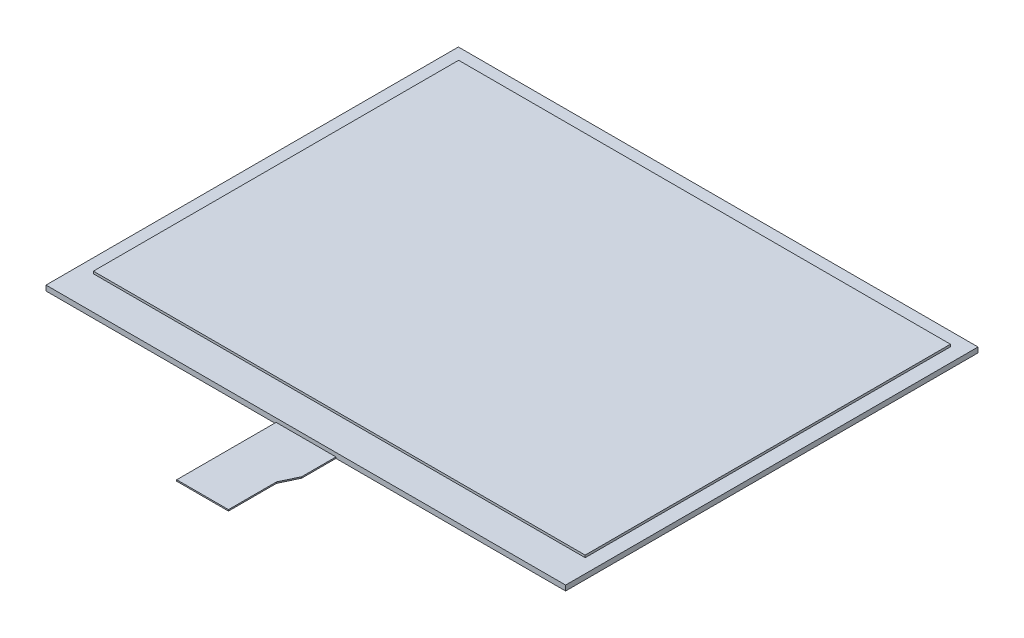
ISO-10303-21;
HEADER;
FILE_DESCRIPTION(('STEP AP214'),'2;1');
FILE_NAME('part.step','',(''),(''),'','','');
FILE_SCHEMA(('AUTOMOTIVE_DESIGN { 1 0 10303 214 1 1 1 1 }'));
ENDSEC;
DATA;
#1=APPLICATION_CONTEXT('core data for automotive mechanical design processes');
#2=APPLICATION_PROTOCOL_DEFINITION('international standard','automotive_design',2000,#1);
#3=PRODUCT_CONTEXT('',#1,'mechanical');
#4=PRODUCT('Part','Part','',(#3));
#5=PRODUCT_RELATED_PRODUCT_CATEGORY('part','',(#4));
#6=PRODUCT_DEFINITION_FORMATION('','',#4);
#7=PRODUCT_DEFINITION_CONTEXT('part definition',#1,'design');
#8=PRODUCT_DEFINITION('design','',#6,#7);
#9=PRODUCT_DEFINITION_SHAPE('','',#8);
#10=(LENGTH_UNIT() NAMED_UNIT(*) SI_UNIT(.MILLI.,.METRE.));
#11=(NAMED_UNIT(*) PLANE_ANGLE_UNIT() SI_UNIT($,.RADIAN.));
#12=(NAMED_UNIT(*) SI_UNIT($,.STERADIAN.) SOLID_ANGLE_UNIT());
#13=UNCERTAINTY_MEASURE_WITH_UNIT(LENGTH_MEASURE(1.E-05),#10,'distance_accuracy_value','');
#14=(GEOMETRIC_REPRESENTATION_CONTEXT(3) GLOBAL_UNCERTAINTY_ASSIGNED_CONTEXT((#13)) GLOBAL_UNIT_ASSIGNED_CONTEXT((#10,
#11,#12)) REPRESENTATION_CONTEXT('',''));
#15=CARTESIAN_POINT('',(0.,0.,0.));
#16=DIRECTION('',(0.,0.,1.));
#17=DIRECTION('',(1.,0.,0.));
#18=AXIS2_PLACEMENT_3D('',#15,#16,#17);
#19=CARTESIAN_POINT('',(0.,1.25,99.6));
#20=DIRECTION('',(0.,0.,-1.));
#21=DIRECTION('',(-1.,0.,0.));
#22=AXIS2_PLACEMENT_3D('',#19,#20,#21);
#23=PLANE('',#22);
#24=DIRECTION('',(0.,-1.,0.));
#25=VECTOR('',#24,1.);
#26=CARTESIAN_POINT('',(55.57,0.315,99.6));
#27=LINE('',#26,#25);
#28=CARTESIAN_POINT('',(55.57,0.315,99.6));
#29=VERTEX_POINT('',#28);
#30=CARTESIAN_POINT('',(55.57,0.,99.6));
#31=VERTEX_POINT('',#30);
#32=EDGE_CURVE('E158',#29,#31,#27,.T.);
#33=ORIENTED_EDGE('',*,*,#32,.F.);
#34=DIRECTION('',(1.,0.,0.));
#35=VECTOR('',#34,1.);
#36=CARTESIAN_POINT('',(55.57,0.315,99.6));
#37=LINE('',#36,#35);
#38=CARTESIAN_POINT('',(70.03,0.315,99.6));
#39=VERTEX_POINT('',#38);
#40=EDGE_CURVE('E143',#29,#39,#37,.T.);
#41=ORIENTED_EDGE('',*,*,#40,.T.);
#42=DIRECTION('',(0.,-1.,0.));
#43=VECTOR('',#42,1.);
#44=CARTESIAN_POINT('',(70.03,0.315,99.6));
#45=LINE('',#44,#43);
#46=CARTESIAN_POINT('',(70.03,0.,99.6));
#47=VERTEX_POINT('',#46);
#48=EDGE_CURVE('E165',#39,#47,#45,.T.);
#49=ORIENTED_EDGE('',*,*,#48,.T.);
#50=DIRECTION('',(1.,0.,0.));
#51=VECTOR('',#50,1.);
#52=CARTESIAN_POINT('',(0.,0.,99.6));
#53=LINE('',#52,#51);
#54=CARTESIAN_POINT('',(125.5,0.,99.6));
#55=VERTEX_POINT('',#54);
#56=EDGE_CURVE('E218',#47,#55,#53,.T.);
#57=ORIENTED_EDGE('',*,*,#56,.T.);
#58=DIRECTION('',(0.,-1.,0.));
#59=VECTOR('',#58,1.);
#60=CARTESIAN_POINT('',(125.5,1.25,99.6));
#61=LINE('',#60,#59);
#62=CARTESIAN_POINT('',(125.5,1.25,99.6));
#63=VERTEX_POINT('',#62);
#64=EDGE_CURVE('E49',#63,#55,#61,.T.);
#65=ORIENTED_EDGE('',*,*,#64,.F.);
#66=DIRECTION('',(1.,0.,0.));
#67=VECTOR('',#66,1.);
#68=CARTESIAN_POINT('',(0.,1.25,99.6));
#69=LINE('',#68,#67);
#70=CARTESIAN_POINT('',(0.,1.25,99.6));
#71=VERTEX_POINT('',#70);
#72=EDGE_CURVE('E208',#71,#63,#69,.T.);
#73=ORIENTED_EDGE('',*,*,#72,.F.);
#74=DIRECTION('',(0.,-1.,0.));
#75=VECTOR('',#74,1.);
#76=CARTESIAN_POINT('',(0.,1.25,99.6));
#77=LINE('',#76,#75);
#78=CARTESIAN_POINT('',(0.,0.,99.6));
#79=VERTEX_POINT('',#78);
#80=EDGE_CURVE('E11',#71,#79,#77,.T.);
#81=ORIENTED_EDGE('',*,*,#80,.T.);
#82=EDGE_CURVE('E164',#79,#31,#53,.T.);
#83=ORIENTED_EDGE('',*,*,#82,.T.);
#84=EDGE_LOOP('',(#33,#41,#49,#57,#65,#73,#81,#83));
#85=FACE_BOUND('',#84,.T.);
#86=ADVANCED_FACE('F41',(#85),#23,.F.);
#87=CARTESIAN_POINT('',(0.,1.25,0.));
#88=DIRECTION('',(1.,0.,0.));
#89=DIRECTION('',(0.,0.,-1.));
#90=AXIS2_PLACEMENT_3D('',#87,#88,#89);
#91=PLANE('',#90);
#92=DIRECTION('',(0.,0.,1.));
#93=VECTOR('',#92,1.);
#94=CARTESIAN_POINT('',(0.,0.,0.));
#95=LINE('',#94,#93);
#96=CARTESIAN_POINT('',(0.,0.,0.));
#97=VERTEX_POINT('',#96);
#98=EDGE_CURVE('E204',#97,#79,#95,.T.);
#99=ORIENTED_EDGE('',*,*,#98,.T.);
#100=ORIENTED_EDGE('',*,*,#80,.F.);
#101=DIRECTION('',(0.,0.,1.));
#102=VECTOR('',#101,1.);
#103=CARTESIAN_POINT('',(0.,1.25,0.));
#104=LINE('',#103,#102);
#105=CARTESIAN_POINT('',(0.,1.25,0.));
#106=VERTEX_POINT('',#105);
#107=EDGE_CURVE('E205',#106,#71,#104,.T.);
#108=ORIENTED_EDGE('',*,*,#107,.F.);
#109=DIRECTION('',(0.,-1.,0.));
#110=VECTOR('',#109,1.);
#111=CARTESIAN_POINT('',(0.,1.25,0.));
#112=LINE('',#111,#110);
#113=EDGE_CURVE('E215',#106,#97,#112,.T.);
#114=ORIENTED_EDGE('',*,*,#113,.T.);
#115=EDGE_LOOP('',(#99,#100,#108,#114));
#116=FACE_BOUND('',#115,.T.);
#117=ADVANCED_FACE('F43',(#116),#91,.F.);
#118=CARTESIAN_POINT('',(125.5,1.25,0.));
#119=DIRECTION('',(-1.,0.,0.));
#120=DIRECTION('',(0.,0.,1.));
#121=AXIS2_PLACEMENT_3D('',#118,#119,#120);
#122=PLANE('',#121);
#123=DIRECTION('',(0.,0.,-1.));
#124=VECTOR('',#123,1.);
#125=CARTESIAN_POINT('',(125.5,0.,0.));
#126=LINE('',#125,#124);
#127=CARTESIAN_POINT('',(125.5,0.,0.));
#128=VERTEX_POINT('',#127);
#129=EDGE_CURVE('E220',#55,#128,#126,.T.);
#130=ORIENTED_EDGE('',*,*,#129,.T.);
#131=DIRECTION('',(0.,-1.,0.));
#132=VECTOR('',#131,1.);
#133=CARTESIAN_POINT('',(125.5,1.25,0.));
#134=LINE('',#133,#132);
#135=CARTESIAN_POINT('',(125.5,1.25,0.));
#136=VERTEX_POINT('',#135);
#137=EDGE_CURVE('E225',#136,#128,#134,.T.);
#138=ORIENTED_EDGE('',*,*,#137,.F.);
#139=DIRECTION('',(0.,0.,-1.));
#140=VECTOR('',#139,1.);
#141=CARTESIAN_POINT('',(125.5,1.25,0.));
#142=LINE('',#141,#140);
#143=EDGE_CURVE('E211',#63,#136,#142,.T.);
#144=ORIENTED_EDGE('',*,*,#143,.F.);
#145=ORIENTED_EDGE('',*,*,#64,.T.);
#146=EDGE_LOOP('',(#130,#138,#144,#145));
#147=FACE_BOUND('',#146,.T.);
#148=ADVANCED_FACE('F232',(#147),#122,.F.);
#149=CARTESIAN_POINT('',(0.,1.25,0.));
#150=DIRECTION('',(0.,0.,1.));
#151=DIRECTION('',(1.,0.,0.));
#152=AXIS2_PLACEMENT_3D('',#149,#150,#151);
#153=PLANE('',#152);
#154=DIRECTION('',(-1.,0.,0.));
#155=VECTOR('',#154,1.);
#156=CARTESIAN_POINT('',(0.,0.,0.));
#157=LINE('',#156,#155);
#158=EDGE_CURVE('E209',#128,#97,#157,.T.);
#159=ORIENTED_EDGE('',*,*,#158,.T.);
#160=ORIENTED_EDGE('',*,*,#113,.F.);
#161=DIRECTION('',(-1.,0.,0.));
#162=VECTOR('',#161,1.);
#163=CARTESIAN_POINT('',(0.,1.25,0.));
#164=LINE('',#163,#162);
#165=EDGE_CURVE('E213',#136,#106,#164,.T.);
#166=ORIENTED_EDGE('',*,*,#165,.F.);
#167=ORIENTED_EDGE('',*,*,#137,.T.);
#168=EDGE_LOOP('',(#159,#160,#166,#167));
#169=FACE_BOUND('',#168,.T.);
#170=ADVANCED_FACE('F241',(#169),#153,.F.);
#171=CARTESIAN_POINT('',(0.,1.25,0.));
#172=DIRECTION('',(0.,1.,0.));
#173=DIRECTION('',(0.,0.,1.));
#174=AXIS2_PLACEMENT_3D('',#171,#172,#173);
#175=PLANE('',#174);
#176=DIRECTION('',(0.,0.,1.));
#177=VECTOR('',#176,1.);
#178=CARTESIAN_POINT('',(3.36,1.25,3.3));
#179=LINE('',#178,#177);
#180=CARTESIAN_POINT('',(3.36,1.25,3.3));
#181=VERTEX_POINT('',#180);
#182=CARTESIAN_POINT('',(3.36000000000001,1.25,91.52));
#183=VERTEX_POINT('',#182);
#184=EDGE_CURVE('E64',#181,#183,#179,.T.);
#185=ORIENTED_EDGE('',*,*,#184,.F.);
#186=DIRECTION('',(-1.,0.,0.));
#187=VECTOR('',#186,1.);
#188=CARTESIAN_POINT('',(3.36,1.25,3.3));
#189=LINE('',#188,#187);
#190=CARTESIAN_POINT('',(122.14,1.25,3.3));
#191=VERTEX_POINT('',#190);
#192=EDGE_CURVE('E178',#191,#181,#189,.T.);
#193=ORIENTED_EDGE('',*,*,#192,.F.);
#194=DIRECTION('',(0.,0.,-1.));
#195=VECTOR('',#194,1.);
#196=CARTESIAN_POINT('',(122.14,1.25,3.3));
#197=LINE('',#196,#195);
#198=CARTESIAN_POINT('',(122.14,1.25,91.52));
#199=VERTEX_POINT('',#198);
#200=EDGE_CURVE('E189',#199,#191,#197,.T.);
#201=ORIENTED_EDGE('',*,*,#200,.F.);
#202=DIRECTION('',(1.,0.,0.));
#203=VECTOR('',#202,1.);
#204=CARTESIAN_POINT('',(3.36000000000001,1.25,91.52));
#205=LINE('',#204,#203);
#206=EDGE_CURVE('E186',#183,#199,#205,.T.);
#207=ORIENTED_EDGE('',*,*,#206,.F.);
#208=EDGE_LOOP('',(#185,#193,#201,#207));
#209=FACE_BOUND('',#208,.T.);
#210=ORIENTED_EDGE('',*,*,#107,.T.);
#211=ORIENTED_EDGE('',*,*,#72,.T.);
#212=ORIENTED_EDGE('',*,*,#143,.T.);
#213=ORIENTED_EDGE('',*,*,#165,.T.);
#214=EDGE_LOOP('',(#210,#211,#212,#213));
#215=FACE_BOUND('',#214,.T.);
#216=ADVANCED_FACE('F247',(#209,#215),#175,.T.);
#217=CARTESIAN_POINT('',(0.,0.,0.));
#218=DIRECTION('',(0.,1.,0.));
#219=DIRECTION('',(0.,0.,1.));
#220=AXIS2_PLACEMENT_3D('',#217,#218,#219);
#221=PLANE('',#220);
#222=ORIENTED_EDGE('',*,*,#98,.F.);
#223=ORIENTED_EDGE('',*,*,#158,.F.);
#224=ORIENTED_EDGE('',*,*,#129,.F.);
#225=ORIENTED_EDGE('',*,*,#56,.F.);
#226=DIRECTION('',(0.,0.,1.));
#227=VECTOR('',#226,1.);
#228=CARTESIAN_POINT('',(70.03,0.,99.6));
#229=LINE('',#228,#227);
#230=CARTESIAN_POINT('',(70.03,0.,107.870480890408));
#231=VERTEX_POINT('',#230);
#232=EDGE_CURVE('E56',#47,#231,#229,.T.);
#233=ORIENTED_EDGE('',*,*,#232,.T.);
#234=DIRECTION('',(-0.42782749163252,0.,0.903860408140232));
#235=VECTOR('',#234,1.);
#236=CARTESIAN_POINT('',(68.07,0.,112.01132371749));
#237=LINE('',#236,#235);
#238=CARTESIAN_POINT('',(68.07,0.,112.01132371749));
#239=VERTEX_POINT('',#238);
#240=EDGE_CURVE('E399',#231,#239,#237,.T.);
#241=ORIENTED_EDGE('',*,*,#240,.T.);
#242=DIRECTION('',(0.,0.,1.));
#243=VECTOR('',#242,1.);
#244=CARTESIAN_POINT('',(68.07,0.,123.6));
#245=LINE('',#244,#243);
#246=CARTESIAN_POINT('',(68.07,0.,123.6));
#247=VERTEX_POINT('',#246);
#248=EDGE_CURVE('E404',#239,#247,#245,.T.);
#249=ORIENTED_EDGE('',*,*,#248,.T.);
#250=DIRECTION('',(-1.,0.,0.));
#251=VECTOR('',#250,1.);
#252=CARTESIAN_POINT('',(55.57,0.,123.6));
#253=LINE('',#252,#251);
#254=CARTESIAN_POINT('',(55.57,0.,123.6));
#255=VERTEX_POINT('',#254);
#256=EDGE_CURVE('E161',#247,#255,#253,.T.);
#257=ORIENTED_EDGE('',*,*,#256,.T.);
#258=DIRECTION('',(0.,0.,-1.));
#259=VECTOR('',#258,1.);
#260=CARTESIAN_POINT('',(55.57,0.,99.6));
#261=LINE('',#260,#259);
#262=EDGE_CURVE('E406',#255,#31,#261,.T.);
#263=ORIENTED_EDGE('',*,*,#262,.T.);
#264=ORIENTED_EDGE('',*,*,#82,.F.);
#265=EDGE_LOOP('',(#222,#223,#224,#225,#233,#241,#249,#257,#263,#264));
#266=FACE_BOUND('',#265,.T.);
#267=ADVANCED_FACE('F238',(#266),#221,.F.);
#268=CARTESIAN_POINT('',(3.36,1.8,3.3));
#269=DIRECTION('',(1.,0.,0.));
#270=DIRECTION('',(0.,0.,-1.));
#271=AXIS2_PLACEMENT_3D('',#268,#269,#270);
#272=PLANE('',#271);
#273=ORIENTED_EDGE('',*,*,#184,.T.);
#274=DIRECTION('',(0.,-1.,0.));
#275=VECTOR('',#274,1.);
#276=CARTESIAN_POINT('',(3.36000000000001,1.8,91.52));
#277=LINE('',#276,#275);
#278=CARTESIAN_POINT('',(3.36000000000001,1.8,91.52));
#279=VERTEX_POINT('',#278);
#280=EDGE_CURVE('E201',#279,#183,#277,.T.);
#281=ORIENTED_EDGE('',*,*,#280,.F.);
#282=DIRECTION('',(0.,0.,1.));
#283=VECTOR('',#282,1.);
#284=CARTESIAN_POINT('',(3.36,1.8,3.3));
#285=LINE('',#284,#283);
#286=CARTESIAN_POINT('',(3.36,1.8,3.3));
#287=VERTEX_POINT('',#286);
#288=EDGE_CURVE('E174',#287,#279,#285,.T.);
#289=ORIENTED_EDGE('',*,*,#288,.F.);
#290=DIRECTION('',(0.,-1.,0.));
#291=VECTOR('',#290,1.);
#292=CARTESIAN_POINT('',(3.36,1.8,3.3));
#293=LINE('',#292,#291);
#294=EDGE_CURVE('E184',#287,#181,#293,.T.);
#295=ORIENTED_EDGE('',*,*,#294,.T.);
#296=EDGE_LOOP('',(#273,#281,#289,#295));
#297=FACE_BOUND('',#296,.T.);
#298=ADVANCED_FACE('F255',(#297),#272,.F.);
#299=CARTESIAN_POINT('',(3.36000000000001,1.8,91.52));
#300=DIRECTION('',(0.,0.,-1.));
#301=DIRECTION('',(-1.,0.,0.));
#302=AXIS2_PLACEMENT_3D('',#299,#300,#301);
#303=PLANE('',#302);
#304=ORIENTED_EDGE('',*,*,#206,.T.);
#305=DIRECTION('',(0.,-1.,0.));
#306=VECTOR('',#305,1.);
#307=CARTESIAN_POINT('',(122.14,1.8,91.52));
#308=LINE('',#307,#306);
#309=CARTESIAN_POINT('',(122.14,1.8,91.52));
#310=VERTEX_POINT('',#309);
#311=EDGE_CURVE('E198',#310,#199,#308,.T.);
#312=ORIENTED_EDGE('',*,*,#311,.F.);
#313=DIRECTION('',(1.,0.,0.));
#314=VECTOR('',#313,1.);
#315=CARTESIAN_POINT('',(3.36000000000001,1.8,91.52));
#316=LINE('',#315,#314);
#317=EDGE_CURVE('E177',#279,#310,#316,.T.);
#318=ORIENTED_EDGE('',*,*,#317,.F.);
#319=ORIENTED_EDGE('',*,*,#280,.T.);
#320=EDGE_LOOP('',(#304,#312,#318,#319));
#321=FACE_BOUND('',#320,.T.);
#322=ADVANCED_FACE('F298',(#321),#303,.F.);
#323=CARTESIAN_POINT('',(122.14,1.8,3.3));
#324=DIRECTION('',(-1.,0.,0.));
#325=DIRECTION('',(0.,0.,1.));
#326=AXIS2_PLACEMENT_3D('',#323,#324,#325);
#327=PLANE('',#326);
#328=ORIENTED_EDGE('',*,*,#200,.T.);
#329=DIRECTION('',(0.,-1.,0.));
#330=VECTOR('',#329,1.);
#331=CARTESIAN_POINT('',(122.14,1.8,3.3));
#332=LINE('',#331,#330);
#333=CARTESIAN_POINT('',(122.14,1.8,3.3));
#334=VERTEX_POINT('',#333);
#335=EDGE_CURVE('E195',#334,#191,#332,.T.);
#336=ORIENTED_EDGE('',*,*,#335,.F.);
#337=DIRECTION('',(0.,0.,-1.));
#338=VECTOR('',#337,1.);
#339=CARTESIAN_POINT('',(122.14,1.8,3.3));
#340=LINE('',#339,#338);
#341=EDGE_CURVE('E180',#310,#334,#340,.T.);
#342=ORIENTED_EDGE('',*,*,#341,.F.);
#343=ORIENTED_EDGE('',*,*,#311,.T.);
#344=EDGE_LOOP('',(#328,#336,#342,#343));
#345=FACE_BOUND('',#344,.T.);
#346=ADVANCED_FACE('F307',(#345),#327,.F.);
#347=CARTESIAN_POINT('',(3.36,1.8,3.3));
#348=DIRECTION('',(0.,0.,1.));
#349=DIRECTION('',(1.,0.,0.));
#350=AXIS2_PLACEMENT_3D('',#347,#348,#349);
#351=PLANE('',#350);
#352=ORIENTED_EDGE('',*,*,#192,.T.);
#353=ORIENTED_EDGE('',*,*,#294,.F.);
#354=DIRECTION('',(-1.,0.,0.));
#355=VECTOR('',#354,1.);
#356=CARTESIAN_POINT('',(3.36,1.8,3.3));
#357=LINE('',#356,#355);
#358=EDGE_CURVE('E182',#334,#287,#357,.T.);
#359=ORIENTED_EDGE('',*,*,#358,.F.);
#360=ORIENTED_EDGE('',*,*,#335,.T.);
#361=EDGE_LOOP('',(#352,#353,#359,#360));
#362=FACE_BOUND('',#361,.T.);
#363=ADVANCED_FACE('F317',(#362),#351,.F.);
#364=CARTESIAN_POINT('',(0.,1.8,0.));
#365=DIRECTION('',(0.,1.,0.));
#366=DIRECTION('',(0.,0.,1.));
#367=AXIS2_PLACEMENT_3D('',#364,#365,#366);
#368=PLANE('',#367);
#369=ORIENTED_EDGE('',*,*,#288,.T.);
#370=ORIENTED_EDGE('',*,*,#317,.T.);
#371=ORIENTED_EDGE('',*,*,#341,.T.);
#372=ORIENTED_EDGE('',*,*,#358,.T.);
#373=EDGE_LOOP('',(#369,#370,#371,#372));
#374=FACE_BOUND('',#373,.T.);
#375=ADVANCED_FACE('F327',(#374),#368,.T.);
#376=CARTESIAN_POINT('',(55.57,0.315,99.6));
#377=DIRECTION('',(-1.,0.,0.));
#378=DIRECTION('',(0.,0.,1.));
#379=AXIS2_PLACEMENT_3D('',#376,#377,#378);
#380=PLANE('',#379);
#381=ORIENTED_EDGE('',*,*,#262,.F.);
#382=DIRECTION('',(0.,-1.,0.));
#383=VECTOR('',#382,1.);
#384=CARTESIAN_POINT('',(55.57,0.315,123.6));
#385=LINE('',#384,#383);
#386=CARTESIAN_POINT('',(55.57,0.315,123.6));
#387=VERTEX_POINT('',#386);
#388=EDGE_CURVE('E160',#387,#255,#385,.T.);
#389=ORIENTED_EDGE('',*,*,#388,.F.);
#390=DIRECTION('',(0.,0.,-1.));
#391=VECTOR('',#390,1.);
#392=CARTESIAN_POINT('',(55.57,0.315,99.6));
#393=LINE('',#392,#391);
#394=EDGE_CURVE('E147',#387,#29,#393,.T.);
#395=ORIENTED_EDGE('',*,*,#394,.T.);
#396=ORIENTED_EDGE('',*,*,#32,.T.);
#397=EDGE_LOOP('',(#381,#389,#395,#396));
#398=FACE_BOUND('',#397,.T.);
#399=ADVANCED_FACE('F157',(#398),#380,.T.);
#400=CARTESIAN_POINT('',(55.57,0.315,123.6));
#401=DIRECTION('',(0.,0.,1.));
#402=DIRECTION('',(1.,0.,0.));
#403=AXIS2_PLACEMENT_3D('',#400,#401,#402);
#404=PLANE('',#403);
#405=ORIENTED_EDGE('',*,*,#256,.F.);
#406=DIRECTION('',(0.,-1.,0.));
#407=VECTOR('',#406,1.);
#408=CARTESIAN_POINT('',(68.07,0.315,123.6));
#409=LINE('',#408,#407);
#410=CARTESIAN_POINT('',(68.07,0.315,123.6));
#411=VERTEX_POINT('',#410);
#412=EDGE_CURVE('E414',#411,#247,#409,.T.);
#413=ORIENTED_EDGE('',*,*,#412,.F.);
#414=DIRECTION('',(-1.,0.,0.));
#415=VECTOR('',#414,1.);
#416=CARTESIAN_POINT('',(55.57,0.315,123.6));
#417=LINE('',#416,#415);
#418=EDGE_CURVE('E166',#411,#387,#417,.T.);
#419=ORIENTED_EDGE('',*,*,#418,.T.);
#420=ORIENTED_EDGE('',*,*,#388,.T.);
#421=EDGE_LOOP('',(#405,#413,#419,#420));
#422=FACE_BOUND('',#421,.T.);
#423=ADVANCED_FACE('F346',(#422),#404,.T.);
#424=CARTESIAN_POINT('',(68.07,0.315,123.6));
#425=DIRECTION('',(1.,0.,0.));
#426=DIRECTION('',(0.,0.,-1.));
#427=AXIS2_PLACEMENT_3D('',#424,#425,#426);
#428=PLANE('',#427);
#429=ORIENTED_EDGE('',*,*,#248,.F.);
#430=DIRECTION('',(0.,-1.,0.));
#431=VECTOR('',#430,1.);
#432=CARTESIAN_POINT('',(68.07,0.315,112.01132371749));
#433=LINE('',#432,#431);
#434=CARTESIAN_POINT('',(68.07,0.315,112.01132371749));
#435=VERTEX_POINT('',#434);
#436=EDGE_CURVE('E401',#435,#239,#433,.T.);
#437=ORIENTED_EDGE('',*,*,#436,.F.);
#438=DIRECTION('',(0.,0.,1.));
#439=VECTOR('',#438,1.);
#440=CARTESIAN_POINT('',(68.07,0.315,123.6));
#441=LINE('',#440,#439);
#442=EDGE_CURVE('E170',#435,#411,#441,.T.);
#443=ORIENTED_EDGE('',*,*,#442,.T.);
#444=ORIENTED_EDGE('',*,*,#412,.T.);
#445=EDGE_LOOP('',(#429,#437,#443,#444));
#446=FACE_BOUND('',#445,.T.);
#447=ADVANCED_FACE('F354',(#446),#428,.T.);
#448=CARTESIAN_POINT('',(68.07,0.315,112.01132371749));
#449=DIRECTION('',(0.903860408140232,0.,0.42782749163252));
#450=DIRECTION('',(0.42782749163252,0.,-0.903860408140232));
#451=AXIS2_PLACEMENT_3D('',#448,#449,#450);
#452=PLANE('',#451);
#453=ORIENTED_EDGE('',*,*,#240,.F.);
#454=DIRECTION('',(0.,-1.,0.));
#455=VECTOR('',#454,1.);
#456=CARTESIAN_POINT('',(70.03,0.315,107.870480890408));
#457=LINE('',#456,#455);
#458=CARTESIAN_POINT('',(70.03,0.315,107.870480890408));
#459=VERTEX_POINT('',#458);
#460=EDGE_CURVE('E168',#459,#231,#457,.T.);
#461=ORIENTED_EDGE('',*,*,#460,.F.);
#462=DIRECTION('',(-0.42782749163252,0.,0.903860408140232));
#463=VECTOR('',#462,1.);
#464=CARTESIAN_POINT('',(68.07,0.315,112.01132371749));
#465=LINE('',#464,#463);
#466=EDGE_CURVE('E416',#459,#435,#465,.T.);
#467=ORIENTED_EDGE('',*,*,#466,.T.);
#468=ORIENTED_EDGE('',*,*,#436,.T.);
#469=EDGE_LOOP('',(#453,#461,#467,#468));
#470=FACE_BOUND('',#469,.T.);
#471=ADVANCED_FACE('F363',(#470),#452,.T.);
#472=CARTESIAN_POINT('',(70.03,0.315,99.6));
#473=DIRECTION('',(1.,0.,0.));
#474=DIRECTION('',(0.,0.,-1.));
#475=AXIS2_PLACEMENT_3D('',#472,#473,#474);
#476=PLANE('',#475);
#477=ORIENTED_EDGE('',*,*,#232,.F.);
#478=ORIENTED_EDGE('',*,*,#48,.F.);
#479=DIRECTION('',(0.,0.,1.));
#480=VECTOR('',#479,1.);
#481=CARTESIAN_POINT('',(70.03,0.315,99.6));
#482=LINE('',#481,#480);
#483=EDGE_CURVE('E151',#39,#459,#482,.T.);
#484=ORIENTED_EDGE('',*,*,#483,.T.);
#485=ORIENTED_EDGE('',*,*,#460,.T.);
#486=EDGE_LOOP('',(#477,#478,#484,#485));
#487=FACE_BOUND('',#486,.T.);
#488=ADVANCED_FACE('F372',(#487),#476,.T.);
#489=CARTESIAN_POINT('',(0.,0.315,0.));
#490=DIRECTION('',(0.,1.,0.));
#491=DIRECTION('',(0.,0.,1.));
#492=AXIS2_PLACEMENT_3D('',#489,#490,#491);
#493=PLANE('',#492);
#494=ORIENTED_EDGE('',*,*,#394,.F.);
#495=ORIENTED_EDGE('',*,*,#418,.F.);
#496=ORIENTED_EDGE('',*,*,#442,.F.);
#497=ORIENTED_EDGE('',*,*,#466,.F.);
#498=ORIENTED_EDGE('',*,*,#483,.F.);
#499=ORIENTED_EDGE('',*,*,#40,.F.);
#500=EDGE_LOOP('',(#494,#495,#496,#497,#498,#499));
#501=FACE_BOUND('',#500,.T.);
#502=ADVANCED_FACE('F145',(#501),#493,.T.);
#503=CLOSED_SHELL('',(#86,#117,#148,#170,#216,#267,#298,#322,#346,#363,#375,#399,#423,#447,#471,
#488,#502));
#504=MANIFOLD_SOLID_BREP('B2',#503);
#505=ADVANCED_BREP_SHAPE_REPRESENTATION('',(#18,#504),#14);
#506=SHAPE_DEFINITION_REPRESENTATION(#9,#505);
ENDSEC;
END-ISO-10303-21;
